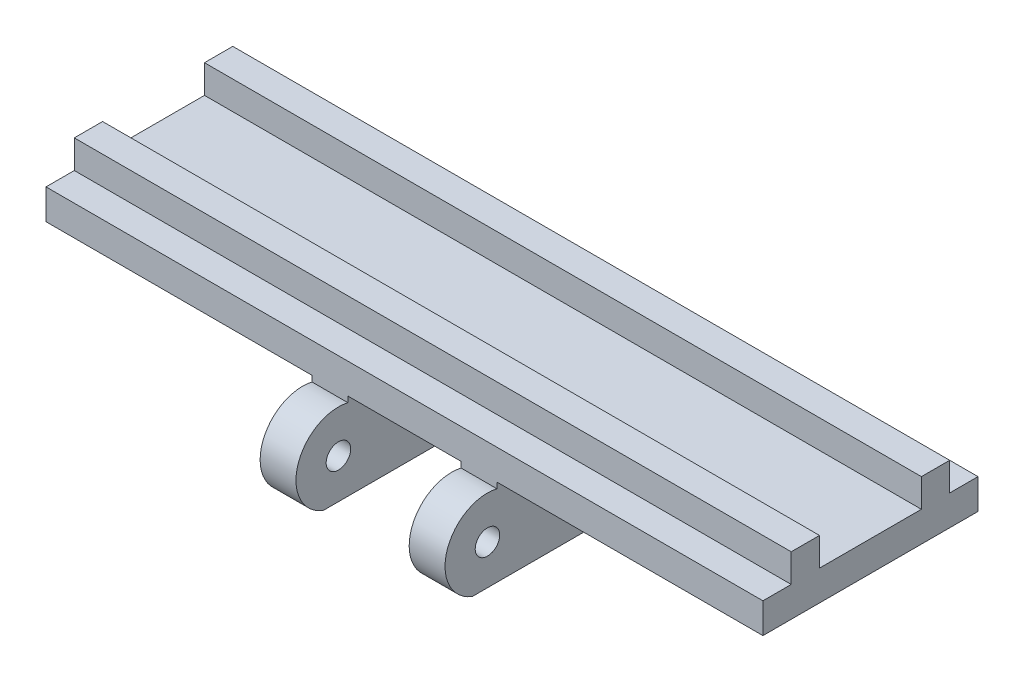
ISO-10303-21;
HEADER;
FILE_DESCRIPTION(('STEP AP214'),'2;1');
FILE_NAME('part.step','',(''),(''),'','','');
FILE_SCHEMA(('AUTOMOTIVE_DESIGN { 1 0 10303 214 1 1 1 1 }'));
ENDSEC;
DATA;
#1=APPLICATION_CONTEXT('core data for automotive mechanical design processes');
#2=APPLICATION_PROTOCOL_DEFINITION('international standard','automotive_design',2000,#1);
#3=PRODUCT_CONTEXT('',#1,'mechanical');
#4=PRODUCT('Part','Part','',(#3));
#5=PRODUCT_RELATED_PRODUCT_CATEGORY('part','',(#4));
#6=PRODUCT_DEFINITION_FORMATION('','',#4);
#7=PRODUCT_DEFINITION_CONTEXT('part definition',#1,'design');
#8=PRODUCT_DEFINITION('design','',#6,#7);
#9=PRODUCT_DEFINITION_SHAPE('','',#8);
#10=(LENGTH_UNIT() NAMED_UNIT(*) SI_UNIT(.MILLI.,.METRE.));
#11=(NAMED_UNIT(*) PLANE_ANGLE_UNIT() SI_UNIT($,.RADIAN.));
#12=(NAMED_UNIT(*) SI_UNIT($,.STERADIAN.) SOLID_ANGLE_UNIT());
#13=UNCERTAINTY_MEASURE_WITH_UNIT(LENGTH_MEASURE(1.E-05),#10,'distance_accuracy_value','');
#14=(GEOMETRIC_REPRESENTATION_CONTEXT(3) GLOBAL_UNCERTAINTY_ASSIGNED_CONTEXT((#13)) GLOBAL_UNIT_ASSIGNED_CONTEXT((#10,
#11,#12)) REPRESENTATION_CONTEXT('',''));
#15=CARTESIAN_POINT('',(0.,0.,0.));
#16=DIRECTION('',(0.,0.,1.));
#17=DIRECTION('',(1.,0.,0.));
#18=AXIS2_PLACEMENT_3D('',#15,#16,#17);
#19=CARTESIAN_POINT('',(-19.,1.6,-5.7));
#20=DIRECTION('',(0.,0.,-1.));
#21=DIRECTION('',(-1.,0.,0.));
#22=AXIS2_PLACEMENT_3D('',#19,#20,#21);
#23=PLANE('',#22);
#24=DIRECTION('',(1.,0.,0.));
#25=VECTOR('',#24,1.);
#26=CARTESIAN_POINT('',(-19.,0.,-5.7));
#27=LINE('',#26,#25);
#28=CARTESIAN_POINT('',(-5.1,0.,-5.7));
#29=VERTEX_POINT('',#28);
#30=CARTESIAN_POINT('',(5.1,0.,-5.7));
#31=VERTEX_POINT('',#30);
#32=EDGE_CURVE('E590',#29,#31,#27,.T.);
#33=ORIENTED_EDGE('',*,*,#32,.F.);
#34=DIRECTION('',(0.,1.,0.));
#35=VECTOR('',#34,1.);
#36=CARTESIAN_POINT('',(-5.1,1.6,-5.7));
#37=LINE('',#36,#35);
#38=CARTESIAN_POINT('',(-5.1,-0.306258903151968,-5.7));
#39=VERTEX_POINT('',#38);
#40=EDGE_CURVE('E369',#39,#29,#37,.T.);
#41=ORIENTED_EDGE('',*,*,#40,.F.);
#42=DIRECTION('',(1.,0.,0.));
#43=VECTOR('',#42,1.);
#44=CARTESIAN_POINT('',(-19.,-0.306258903151968,-5.7));
#45=LINE('',#44,#43);
#46=CARTESIAN_POINT('',(-7.,-0.306258903151968,-5.7));
#47=VERTEX_POINT('',#46);
#48=EDGE_CURVE('E544',#47,#39,#45,.T.);
#49=ORIENTED_EDGE('',*,*,#48,.F.);
#50=DIRECTION('',(0.,1.,0.));
#51=VECTOR('',#50,1.);
#52=CARTESIAN_POINT('',(-7.,-5.,-5.7));
#53=LINE('',#52,#51);
#54=CARTESIAN_POINT('',(-7.,0.,-5.7));
#55=VERTEX_POINT('',#54);
#56=EDGE_CURVE('E547',#47,#55,#53,.T.);
#57=ORIENTED_EDGE('',*,*,#56,.T.);
#58=CARTESIAN_POINT('',(-19.,0.,-5.7));
#59=VERTEX_POINT('',#58);
#60=EDGE_CURVE('E587',#59,#55,#27,.T.);
#61=ORIENTED_EDGE('',*,*,#60,.F.);
#62=DIRECTION('',(0.,-1.,0.));
#63=VECTOR('',#62,1.);
#64=CARTESIAN_POINT('',(-19.,1.6,-5.7));
#65=LINE('',#64,#63);
#66=CARTESIAN_POINT('',(-19.,1.6,-5.7));
#67=VERTEX_POINT('',#66);
#68=EDGE_CURVE('E593',#67,#59,#65,.T.);
#69=ORIENTED_EDGE('',*,*,#68,.F.);
#70=DIRECTION('',(1.,0.,0.));
#71=VECTOR('',#70,1.);
#72=CARTESIAN_POINT('',(-19.,1.6,-5.7));
#73=LINE('',#72,#71);
#74=CARTESIAN_POINT('',(19.,1.6,-5.7));
#75=VERTEX_POINT('',#74);
#76=EDGE_CURVE('E571',#67,#75,#73,.T.);
#77=ORIENTED_EDGE('',*,*,#76,.T.);
#78=DIRECTION('',(0.,-1.,0.));
#79=VECTOR('',#78,1.);
#80=CARTESIAN_POINT('',(19.,1.6,-5.7));
#81=LINE('',#80,#79);
#82=CARTESIAN_POINT('',(19.,0.,-5.7));
#83=VERTEX_POINT('',#82);
#84=EDGE_CURVE('E596',#75,#83,#81,.T.);
#85=ORIENTED_EDGE('',*,*,#84,.T.);
#86=CARTESIAN_POINT('',(7.,0.,-5.7));
#87=VERTEX_POINT('',#86);
#88=EDGE_CURVE('E586',#87,#83,#27,.T.);
#89=ORIENTED_EDGE('',*,*,#88,.F.);
#90=DIRECTION('',(0.,1.,0.));
#91=VECTOR('',#90,1.);
#92=CARTESIAN_POINT('',(7.,-5.,-5.7));
#93=LINE('',#92,#91);
#94=CARTESIAN_POINT('',(7.,-0.306258903151968,-5.7));
#95=VERTEX_POINT('',#94);
#96=EDGE_CURVE('E545',#95,#87,#93,.T.);
#97=ORIENTED_EDGE('',*,*,#96,.F.);
#98=CARTESIAN_POINT('',(5.1,-0.306258903151968,-5.7));
#99=VERTEX_POINT('',#98);
#100=EDGE_CURVE('E541',#99,#95,#45,.T.);
#101=ORIENTED_EDGE('',*,*,#100,.F.);
#102=DIRECTION('',(0.,1.,0.));
#103=VECTOR('',#102,1.);
#104=CARTESIAN_POINT('',(5.1,1.6,-5.7));
#105=LINE('',#104,#103);
#106=EDGE_CURVE('E516',#99,#31,#105,.T.);
#107=ORIENTED_EDGE('',*,*,#106,.T.);
#108=EDGE_LOOP('',(#33,#41,#49,#57,#61,#69,#77,#85,#89,#97,#101,#107));
#109=FACE_BOUND('',#108,.T.);
#110=ADVANCED_FACE('F137',(#109),#23,.T.);
#111=CARTESIAN_POINT('',(-19.,-4.60297408448131,7.));
#112=DIRECTION('',(0.,-1.,0.));
#113=DIRECTION('',(0.,0.,-1.));
#114=AXIS2_PLACEMENT_3D('',#111,#112,#113);
#115=PLANE('',#114);
#116=DIRECTION('',(1.,0.,0.));
#117=VECTOR('',#116,1.);
#118=CARTESIAN_POINT('',(-11.6785538245428,-4.60297408448131,-1.));
#119=LINE('',#118,#117);
#120=CARTESIAN_POINT('',(3.,-4.60297408448131,-1.));
#121=VERTEX_POINT('',#120);
#122=CARTESIAN_POINT('',(5.1,-4.60297408448131,-1.));
#123=VERTEX_POINT('',#122);
#124=EDGE_CURVE('E355',#121,#123,#119,.T.);
#125=ORIENTED_EDGE('',*,*,#124,.T.);
#126=DIRECTION('',(0.,0.,1.));
#127=VECTOR('',#126,1.);
#128=CARTESIAN_POINT('',(5.1,-4.60297408448131,0.));
#129=LINE('',#128,#127);
#130=CARTESIAN_POINT('',(5.1,-4.60297408448131,-7.));
#131=VERTEX_POINT('',#130);
#132=EDGE_CURVE('E473',#131,#123,#129,.T.);
#133=ORIENTED_EDGE('',*,*,#132,.F.);
#134=DIRECTION('',(1.,0.,0.));
#135=VECTOR('',#134,1.);
#136=CARTESIAN_POINT('',(-19.,-4.60297408448131,-7.));
#137=LINE('',#136,#135);
#138=CARTESIAN_POINT('',(7.,-4.60297408448131,-7.));
#139=VERTEX_POINT('',#138);
#140=EDGE_CURVE('E477',#139,#131,#137,.F.);
#141=ORIENTED_EDGE('',*,*,#140,.F.);
#142=DIRECTION('',(0.,0.,1.));
#143=VECTOR('',#142,1.);
#144=CARTESIAN_POINT('',(7.,-4.60297408448131,-7.));
#145=LINE('',#144,#143);
#146=CARTESIAN_POINT('',(7.,-4.60297408448131,1.));
#147=VERTEX_POINT('',#146);
#148=EDGE_CURVE('E480',#139,#147,#145,.T.);
#149=ORIENTED_EDGE('',*,*,#148,.T.);
#150=DIRECTION('',(-1.,0.,0.));
#151=VECTOR('',#150,1.);
#152=CARTESIAN_POINT('',(19.,-4.60297408448131,1.));
#153=LINE('',#152,#151);
#154=CARTESIAN_POINT('',(4.9,-4.60297408448131,1.));
#155=VERTEX_POINT('',#154);
#156=EDGE_CURVE('E390',#147,#155,#153,.T.);
#157=ORIENTED_EDGE('',*,*,#156,.T.);
#158=DIRECTION('',(0.,0.,1.));
#159=VECTOR('',#158,1.);
#160=CARTESIAN_POINT('',(4.9,-4.60297408448131,0.));
#161=LINE('',#160,#159);
#162=CARTESIAN_POINT('',(4.9,-4.60297408448131,7.));
#163=VERTEX_POINT('',#162);
#164=EDGE_CURVE('E483',#155,#163,#161,.T.);
#165=ORIENTED_EDGE('',*,*,#164,.T.);
#166=DIRECTION('',(-1.,0.,0.));
#167=VECTOR('',#166,1.);
#168=CARTESIAN_POINT('',(10.1737557774323,-4.60297408448131,7.));
#169=LINE('',#168,#167);
#170=CARTESIAN_POINT('',(3.,-4.60297408448131,7.));
#171=VERTEX_POINT('',#170);
#172=EDGE_CURVE('E488',#171,#163,#169,.F.);
#173=ORIENTED_EDGE('',*,*,#172,.F.);
#174=DIRECTION('',(0.,0.,1.));
#175=VECTOR('',#174,1.);
#176=CARTESIAN_POINT('',(3.,-4.60297408448131,-7.));
#177=LINE('',#176,#175);
#178=EDGE_CURVE('E475',#121,#171,#177,.T.);
#179=ORIENTED_EDGE('',*,*,#178,.F.);
#180=EDGE_LOOP('',(#125,#133,#141,#149,#157,#165,#173,#179));
#181=FACE_BOUND('',#180,.T.);
#182=ADVANCED_FACE('F632',(#181),#115,.T.);
#183=CARTESIAN_POINT('',(0.,1.6,0.));
#184=DIRECTION('',(0.,1.,0.));
#185=DIRECTION('',(0.,0.,1.));
#186=AXIS2_PLACEMENT_3D('',#183,#184,#185);
#187=PLANE('',#186);
#188=DIRECTION('',(0.,0.,-1.));
#189=VECTOR('',#188,1.);
#190=CARTESIAN_POINT('',(19.,1.6,5.7));
#191=LINE('',#190,#189);
#192=CARTESIAN_POINT('',(19.,1.6,5.7));
#193=VERTEX_POINT('',#192);
#194=CARTESIAN_POINT('',(19.,1.6,4.2));
#195=VERTEX_POINT('',#194);
#196=EDGE_CURVE('E160',#193,#195,#191,.T.);
#197=ORIENTED_EDGE('',*,*,#196,.T.);
#198=DIRECTION('',(1.,0.,0.));
#199=VECTOR('',#198,1.);
#200=CARTESIAN_POINT('',(-19.,1.6,4.2));
#201=LINE('',#200,#199);
#202=CARTESIAN_POINT('',(-19.,1.6,4.2));
#203=VERTEX_POINT('',#202);
#204=EDGE_CURVE('E422',#203,#195,#201,.T.);
#205=ORIENTED_EDGE('',*,*,#204,.F.);
#206=DIRECTION('',(0.,0.,-1.));
#207=VECTOR('',#206,1.);
#208=CARTESIAN_POINT('',(-19.,1.6,5.7));
#209=LINE('',#208,#207);
#210=CARTESIAN_POINT('',(-19.,1.6,5.7));
#211=VERTEX_POINT('',#210);
#212=EDGE_CURVE('E576',#211,#203,#209,.T.);
#213=ORIENTED_EDGE('',*,*,#212,.F.);
#214=DIRECTION('',(1.,0.,0.));
#215=VECTOR('',#214,1.);
#216=CARTESIAN_POINT('',(-19.,1.6,5.7));
#217=LINE('',#216,#215);
#218=EDGE_CURVE('E566',#211,#193,#217,.T.);
#219=ORIENTED_EDGE('',*,*,#218,.T.);
#220=EDGE_LOOP('',(#197,#205,#213,#219));
#221=FACE_BOUND('',#220,.T.);
#222=ADVANCED_FACE('F638',(#221),#187,.T.);
#223=CARTESIAN_POINT('',(-19.,1.6,-4.2));
#224=VERTEX_POINT('',#223);
#225=EDGE_CURVE('E575',#224,#67,#209,.T.);
#226=ORIENTED_EDGE('',*,*,#225,.F.);
#227=DIRECTION('',(1.,0.,0.));
#228=VECTOR('',#227,1.);
#229=CARTESIAN_POINT('',(-19.,1.6,-4.19999999999999));
#230=LINE('',#229,#228);
#231=CARTESIAN_POINT('',(19.,1.6,-4.2));
#232=VERTEX_POINT('',#231);
#233=EDGE_CURVE('E426',#224,#232,#230,.T.);
#234=ORIENTED_EDGE('',*,*,#233,.T.);
#235=EDGE_CURVE('E568',#232,#75,#191,.T.);
#236=ORIENTED_EDGE('',*,*,#235,.T.);
#237=ORIENTED_EDGE('',*,*,#76,.F.);
#238=EDGE_LOOP('',(#226,#234,#236,#237));
#239=FACE_BOUND('',#238,.T.);
#240=ADVANCED_FACE('F665',(#239),#187,.T.);
#241=CARTESIAN_POINT('',(3.,-5.,-7.));
#242=DIRECTION('',(-1.,0.,0.));
#243=DIRECTION('',(0.,0.,1.));
#244=AXIS2_PLACEMENT_3D('',#241,#242,#243);
#245=PLANE('',#244);
#246=DIRECTION('',(0.,1.,0.));
#247=VECTOR('',#246,1.);
#248=CARTESIAN_POINT('',(3.,-5.,-1.));
#249=LINE('',#248,#247);
#250=CARTESIAN_POINT('',(3.,0.,-1.));
#251=VERTEX_POINT('',#250);
#252=EDGE_CURVE('E380',#121,#251,#249,.T.);
#253=ORIENTED_EDGE('',*,*,#252,.F.);
#254=ORIENTED_EDGE('',*,*,#178,.T.);
#255=CARTESIAN_POINT('',(3.,-2.5,6.2));
#256=DIRECTION('',(-1.,0.,0.));
#257=DIRECTION('',(0.,0.,1.));
#258=AXIS2_PLACEMENT_3D('',#255,#256,#257);
#259=CIRCLE('',#258,2.25);
#260=CARTESIAN_POINT('',(3.,-0.306258903151968,5.7));
#261=VERTEX_POINT('',#260);
#262=EDGE_CURVE('E507',#171,#261,#259,.T.);
#263=ORIENTED_EDGE('',*,*,#262,.T.);
#264=DIRECTION('',(0.,1.,0.));
#265=VECTOR('',#264,1.);
#266=CARTESIAN_POINT('',(3.,-5.,5.7));
#267=LINE('',#266,#265);
#268=CARTESIAN_POINT('',(3.,0.,5.7));
#269=VERTEX_POINT('',#268);
#270=EDGE_CURVE('E504',#261,#269,#267,.T.);
#271=ORIENTED_EDGE('',*,*,#270,.T.);
#272=DIRECTION('',(0.,0.,1.));
#273=VECTOR('',#272,1.);
#274=CARTESIAN_POINT('',(3.,0.,-7.));
#275=LINE('',#274,#273);
#276=EDGE_CURVE('E562',#251,#269,#275,.T.);
#277=ORIENTED_EDGE('',*,*,#276,.F.);
#278=EDGE_LOOP('',(#253,#254,#263,#271,#277));
#279=FACE_BOUND('',#278,.T.);
#280=CARTESIAN_POINT('',(3.,-2.5,6.2));
#281=DIRECTION('',(-1.,0.,0.));
#282=DIRECTION('',(0.,0.,1.));
#283=AXIS2_PLACEMENT_3D('',#280,#281,#282);
#284=CIRCLE('',#283,0.65);
#285=CARTESIAN_POINT('',(3.,-2.5,6.85));
#286=VERTEX_POINT('',#285);
#287=EDGE_CURVE('E526',#286,#286,#284,.T.);
#288=ORIENTED_EDGE('',*,*,#287,.F.);
#289=EDGE_LOOP('',(#288));
#290=FACE_BOUND('',#289,.T.);
#291=ADVANCED_FACE('F758',(#279,#290),#245,.T.);
#292=CARTESIAN_POINT('',(-3.,-5.,-7.));
#293=DIRECTION('',(-1.,0.,0.));
#294=DIRECTION('',(0.,0.,1.));
#295=AXIS2_PLACEMENT_3D('',#292,#293,#294);
#296=PLANE('',#295);
#297=CARTESIAN_POINT('',(-3.,-2.5,6.2));
#298=DIRECTION('',(-1.,0.,0.));
#299=DIRECTION('',(0.,0.,1.));
#300=AXIS2_PLACEMENT_3D('',#297,#298,#299);
#301=CIRCLE('',#300,0.65);
#302=CARTESIAN_POINT('',(-3.,-2.5,6.85));
#303=VERTEX_POINT('',#302);
#304=EDGE_CURVE('E523',#303,#303,#301,.T.);
#305=ORIENTED_EDGE('',*,*,#304,.T.);
#306=EDGE_LOOP('',(#305));
#307=FACE_BOUND('',#306,.T.);
#308=DIRECTION('',(0.,0.,1.));
#309=VECTOR('',#308,1.);
#310=CARTESIAN_POINT('',(-3.,-4.60297408448131,-7.));
#311=LINE('',#310,#309);
#312=CARTESIAN_POINT('',(-3.,-4.60297408448131,-1.));
#313=VERTEX_POINT('',#312);
#314=CARTESIAN_POINT('',(-3.,-4.60297408448131,7.));
#315=VERTEX_POINT('',#314);
#316=EDGE_CURVE('E463',#313,#315,#311,.T.);
#317=ORIENTED_EDGE('',*,*,#316,.F.);
#318=DIRECTION('',(0.,1.,0.));
#319=VECTOR('',#318,1.);
#320=CARTESIAN_POINT('',(-3.,-5.,-1.));
#321=LINE('',#320,#319);
#322=CARTESIAN_POINT('',(-3.,0.,-1.));
#323=VERTEX_POINT('',#322);
#324=EDGE_CURVE('E377',#313,#323,#321,.T.);
#325=ORIENTED_EDGE('',*,*,#324,.T.);
#326=DIRECTION('',(0.,0.,1.));
#327=VECTOR('',#326,1.);
#328=CARTESIAN_POINT('',(-3.,0.,0.));
#329=LINE('',#328,#327);
#330=CARTESIAN_POINT('',(-3.,0.,5.7));
#331=VERTEX_POINT('',#330);
#332=EDGE_CURVE('E363',#323,#331,#329,.T.);
#333=ORIENTED_EDGE('',*,*,#332,.T.);
#334=DIRECTION('',(0.,1.,0.));
#335=VECTOR('',#334,1.);
#336=CARTESIAN_POINT('',(-3.,-5.,5.7));
#337=LINE('',#336,#335);
#338=CARTESIAN_POINT('',(-3.,-0.306258903151968,5.7));
#339=VERTEX_POINT('',#338);
#340=EDGE_CURVE('E498',#339,#331,#337,.T.);
#341=ORIENTED_EDGE('',*,*,#340,.F.);
#342=CARTESIAN_POINT('',(-3.,-2.5,6.2));
#343=DIRECTION('',(-1.,0.,0.));
#344=DIRECTION('',(0.,0.,1.));
#345=AXIS2_PLACEMENT_3D('',#342,#343,#344);
#346=CIRCLE('',#345,2.25);
#347=EDGE_CURVE('E513',#315,#339,#346,.T.);
#348=ORIENTED_EDGE('',*,*,#347,.F.);
#349=EDGE_LOOP('',(#317,#325,#333,#341,#348));
#350=FACE_BOUND('',#349,.T.);
#351=ADVANCED_FACE('F701',(#307,#350),#296,.F.);
#352=CARTESIAN_POINT('',(-4.9,-5.,0.));
#353=DIRECTION('',(-1.,0.,0.));
#354=DIRECTION('',(0.,0.,1.));
#355=AXIS2_PLACEMENT_3D('',#352,#353,#354);
#356=PLANE('',#355);
#357=CARTESIAN_POINT('',(-4.9,-2.5,6.2));
#358=DIRECTION('',(-1.,0.,0.));
#359=DIRECTION('',(0.,0.,1.));
#360=AXIS2_PLACEMENT_3D('',#357,#358,#359);
#361=CIRCLE('',#360,0.65);
#362=CARTESIAN_POINT('',(-4.9,-2.5,6.85));
#363=VERTEX_POINT('',#362);
#364=EDGE_CURVE('E520',#363,#363,#361,.T.);
#365=ORIENTED_EDGE('',*,*,#364,.F.);
#366=EDGE_LOOP('',(#365));
#367=FACE_BOUND('',#366,.T.);
#368=DIRECTION('',(0.,1.,0.));
#369=VECTOR('',#368,1.);
#370=CARTESIAN_POINT('',(-4.9,-5.,5.7));
#371=LINE('',#370,#369);
#372=CARTESIAN_POINT('',(-4.9,-0.306258903151968,5.7));
#373=VERTEX_POINT('',#372);
#374=CARTESIAN_POINT('',(-4.9,0.,5.7));
#375=VERTEX_POINT('',#374);
#376=EDGE_CURVE('E495',#373,#375,#371,.T.);
#377=ORIENTED_EDGE('',*,*,#376,.T.);
#378=DIRECTION('',(0.,0.,1.));
#379=VECTOR('',#378,1.);
#380=CARTESIAN_POINT('',(-4.9,0.,0.));
#381=LINE('',#380,#379);
#382=CARTESIAN_POINT('',(-4.9,0.,1.));
#383=VERTEX_POINT('',#382);
#384=EDGE_CURVE('E396',#383,#375,#381,.T.);
#385=ORIENTED_EDGE('',*,*,#384,.F.);
#386=DIRECTION('',(0.,1.,0.));
#387=VECTOR('',#386,1.);
#388=CARTESIAN_POINT('',(-4.9,-5.,1.));
#389=LINE('',#388,#387);
#390=CARTESIAN_POINT('',(-4.9,-4.60297408448131,1.));
#391=VERTEX_POINT('',#390);
#392=EDGE_CURVE('E399',#391,#383,#389,.T.);
#393=ORIENTED_EDGE('',*,*,#392,.F.);
#394=DIRECTION('',(0.,0.,1.));
#395=VECTOR('',#394,1.);
#396=CARTESIAN_POINT('',(-4.9,-4.60297408448131,0.));
#397=LINE('',#396,#395);
#398=CARTESIAN_POINT('',(-4.9,-4.60297408448131,7.));
#399=VERTEX_POINT('',#398);
#400=EDGE_CURVE('E471',#391,#399,#397,.T.);
#401=ORIENTED_EDGE('',*,*,#400,.T.);
#402=CARTESIAN_POINT('',(-4.9,-2.5,6.2));
#403=DIRECTION('',(-1.,0.,0.));
#404=DIRECTION('',(0.,0.,1.));
#405=AXIS2_PLACEMENT_3D('',#402,#403,#404);
#406=CIRCLE('',#405,2.25);
#407=EDGE_CURVE('E510',#399,#373,#406,.T.);
#408=ORIENTED_EDGE('',*,*,#407,.T.);
#409=EDGE_LOOP('',(#377,#385,#393,#401,#408));
#410=FACE_BOUND('',#409,.T.);
#411=ADVANCED_FACE('F690',(#367,#410),#356,.T.);
#412=CARTESIAN_POINT('',(4.9,-5.,0.));
#413=DIRECTION('',(-1.,0.,0.));
#414=DIRECTION('',(0.,0.,1.));
#415=AXIS2_PLACEMENT_3D('',#412,#413,#414);
#416=PLANE('',#415);
#417=CARTESIAN_POINT('',(4.9,-2.5,6.2));
#418=DIRECTION('',(-1.,0.,0.));
#419=DIRECTION('',(0.,0.,1.));
#420=AXIS2_PLACEMENT_3D('',#417,#418,#419);
#421=CIRCLE('',#420,0.65);
#422=CARTESIAN_POINT('',(4.9,-2.5,6.85));
#423=VERTEX_POINT('',#422);
#424=EDGE_CURVE('E519',#423,#423,#421,.T.);
#425=ORIENTED_EDGE('',*,*,#424,.T.);
#426=EDGE_LOOP('',(#425));
#427=FACE_BOUND('',#426,.T.);
#428=DIRECTION('',(0.,1.,0.));
#429=VECTOR('',#428,1.);
#430=CARTESIAN_POINT('',(4.9,-5.,5.7));
#431=LINE('',#430,#429);
#432=CARTESIAN_POINT('',(4.9,-0.306258903151968,5.7));
#433=VERTEX_POINT('',#432);
#434=CARTESIAN_POINT('',(4.9,0.,5.7));
#435=VERTEX_POINT('',#434);
#436=EDGE_CURVE('E499',#433,#435,#431,.T.);
#437=ORIENTED_EDGE('',*,*,#436,.F.);
#438=CARTESIAN_POINT('',(4.9,-2.5,6.2));
#439=DIRECTION('',(-1.,0.,0.));
#440=DIRECTION('',(0.,0.,1.));
#441=AXIS2_PLACEMENT_3D('',#438,#439,#440);
#442=CIRCLE('',#441,2.25);
#443=EDGE_CURVE('E12',#163,#433,#442,.T.);
#444=ORIENTED_EDGE('',*,*,#443,.F.);
#445=ORIENTED_EDGE('',*,*,#164,.F.);
#446=DIRECTION('',(0.,-1.,0.));
#447=VECTOR('',#446,1.);
#448=CARTESIAN_POINT('',(4.9,-5.,1.));
#449=LINE('',#448,#447);
#450=CARTESIAN_POINT('',(4.9,0.,1.));
#451=VERTEX_POINT('',#450);
#452=EDGE_CURVE('E382',#451,#155,#449,.T.);
#453=ORIENTED_EDGE('',*,*,#452,.F.);
#454=DIRECTION('',(0.,0.,-1.));
#455=VECTOR('',#454,1.);
#456=CARTESIAN_POINT('',(4.9,0.,0.));
#457=LINE('',#456,#455);
#458=EDGE_CURVE('E385',#435,#451,#457,.T.);
#459=ORIENTED_EDGE('',*,*,#458,.F.);
#460=EDGE_LOOP('',(#437,#444,#445,#453,#459));
#461=FACE_BOUND('',#460,.T.);
#462=ADVANCED_FACE('F608',(#427,#461),#416,.F.);
#463=CARTESIAN_POINT('',(-7.,-5.,-7.));
#464=DIRECTION('',(-1.,0.,0.));
#465=DIRECTION('',(0.,0.,1.));
#466=AXIS2_PLACEMENT_3D('',#463,#464,#465);
#467=PLANE('',#466);
#468=DIRECTION('',(0.,-1.,0.));
#469=VECTOR('',#468,1.);
#470=CARTESIAN_POINT('',(-7.,-5.,1.));
#471=LINE('',#470,#469);
#472=CARTESIAN_POINT('',(-7.,0.,1.));
#473=VERTEX_POINT('',#472);
#474=CARTESIAN_POINT('',(-7.,-4.60297408448131,1.));
#475=VERTEX_POINT('',#474);
#476=EDGE_CURVE('E407',#473,#475,#471,.T.);
#477=ORIENTED_EDGE('',*,*,#476,.F.);
#478=DIRECTION('',(0.,0.,1.));
#479=VECTOR('',#478,1.);
#480=CARTESIAN_POINT('',(-7.,0.,0.));
#481=LINE('',#480,#479);
#482=EDGE_CURVE('E565',#55,#473,#481,.T.);
#483=ORIENTED_EDGE('',*,*,#482,.F.);
#484=ORIENTED_EDGE('',*,*,#56,.F.);
#485=CARTESIAN_POINT('',(-7.,-2.5,-6.2));
#486=DIRECTION('',(-1.,0.,0.));
#487=DIRECTION('',(0.,0.,1.));
#488=AXIS2_PLACEMENT_3D('',#485,#486,#487);
#489=CIRCLE('',#488,2.25);
#490=CARTESIAN_POINT('',(-7.,-4.60297408448131,-7.));
#491=VERTEX_POINT('',#490);
#492=EDGE_CURVE('E555',#47,#491,#489,.T.);
#493=ORIENTED_EDGE('',*,*,#492,.T.);
#494=DIRECTION('',(0.,0.,1.));
#495=VECTOR('',#494,1.);
#496=CARTESIAN_POINT('',(-7.,-4.60297408448131,-7.));
#497=LINE('',#496,#495);
#498=EDGE_CURVE('E468',#491,#475,#497,.T.);
#499=ORIENTED_EDGE('',*,*,#498,.T.);
#500=EDGE_LOOP('',(#477,#483,#484,#493,#499));
#501=FACE_BOUND('',#500,.T.);
#502=CARTESIAN_POINT('',(-7.,-2.5,-6.2));
#503=DIRECTION('',(-1.,0.,0.));
#504=DIRECTION('',(0.,0.,1.));
#505=AXIS2_PLACEMENT_3D('',#502,#503,#504);
#506=CIRCLE('',#505,0.55);
#507=CARTESIAN_POINT('',(-7.,-2.5,-5.65));
#508=VERTEX_POINT('',#507);
#509=EDGE_CURVE('E538',#508,#508,#506,.T.);
#510=ORIENTED_EDGE('',*,*,#509,.F.);
#511=EDGE_LOOP('',(#510));
#512=FACE_BOUND('',#511,.T.);
#513=ADVANCED_FACE('F708',(#501,#512),#467,.T.);
#514=CARTESIAN_POINT('',(7.,-5.,-7.));
#515=DIRECTION('',(-1.,0.,0.));
#516=DIRECTION('',(0.,0.,1.));
#517=AXIS2_PLACEMENT_3D('',#514,#515,#516);
#518=PLANE('',#517);
#519=CARTESIAN_POINT('',(7.,-2.5,-6.2));
#520=DIRECTION('',(-1.,0.,0.));
#521=DIRECTION('',(0.,0.,1.));
#522=AXIS2_PLACEMENT_3D('',#519,#520,#521);
#523=CIRCLE('',#522,0.55);
#524=CARTESIAN_POINT('',(7.,-2.5,-5.65));
#525=VERTEX_POINT('',#524);
#526=EDGE_CURVE('E535',#525,#525,#523,.T.);
#527=ORIENTED_EDGE('',*,*,#526,.T.);
#528=EDGE_LOOP('',(#527));
#529=FACE_BOUND('',#528,.T.);
#530=DIRECTION('',(0.,0.,1.));
#531=VECTOR('',#530,1.);
#532=CARTESIAN_POINT('',(7.,0.,-7.));
#533=LINE('',#532,#531);
#534=CARTESIAN_POINT('',(7.,0.,1.));
#535=VERTEX_POINT('',#534);
#536=EDGE_CURVE('E559',#87,#535,#533,.T.);
#537=ORIENTED_EDGE('',*,*,#536,.T.);
#538=DIRECTION('',(0.,-1.,0.));
#539=VECTOR('',#538,1.);
#540=CARTESIAN_POINT('',(7.,-5.,1.));
#541=LINE('',#540,#539);
#542=EDGE_CURVE('E393',#535,#147,#541,.T.);
#543=ORIENTED_EDGE('',*,*,#542,.T.);
#544=ORIENTED_EDGE('',*,*,#148,.F.);
#545=CARTESIAN_POINT('',(7.,-2.5,-6.2));
#546=DIRECTION('',(-1.,0.,0.));
#547=DIRECTION('',(0.,0.,1.));
#548=AXIS2_PLACEMENT_3D('',#545,#546,#547);
#549=CIRCLE('',#548,2.25);
#550=EDGE_CURVE('E549',#95,#139,#549,.T.);
#551=ORIENTED_EDGE('',*,*,#550,.F.);
#552=ORIENTED_EDGE('',*,*,#96,.T.);
#553=EDGE_LOOP('',(#537,#543,#544,#551,#552));
#554=FACE_BOUND('',#553,.T.);
#555=ADVANCED_FACE('F769',(#529,#554),#518,.F.);
#556=CARTESIAN_POINT('',(-5.1,-5.,0.));
#557=DIRECTION('',(-1.,0.,0.));
#558=DIRECTION('',(0.,0.,1.));
#559=AXIS2_PLACEMENT_3D('',#556,#557,#558);
#560=PLANE('',#559);
#561=CARTESIAN_POINT('',(-5.1,-2.5,-6.2));
#562=DIRECTION('',(-1.,0.,0.));
#563=DIRECTION('',(0.,0.,1.));
#564=AXIS2_PLACEMENT_3D('',#561,#562,#563);
#565=CIRCLE('',#564,0.55);
#566=CARTESIAN_POINT('',(-5.1,-2.5,-5.65));
#567=VERTEX_POINT('',#566);
#568=EDGE_CURVE('E529',#567,#567,#565,.T.);
#569=ORIENTED_EDGE('',*,*,#568,.T.);
#570=EDGE_LOOP('',(#569));
#571=FACE_BOUND('',#570,.T.);
#572=DIRECTION('',(0.,-1.,0.));
#573=VECTOR('',#572,1.);
#574=CARTESIAN_POINT('',(-5.1,-5.,-1.));
#575=LINE('',#574,#573);
#576=CARTESIAN_POINT('',(-5.1,0.,-1.));
#577=VERTEX_POINT('',#576);
#578=CARTESIAN_POINT('',(-5.1,-4.60297408448131,-1.));
#579=VERTEX_POINT('',#578);
#580=EDGE_CURVE('E345',#577,#579,#575,.T.);
#581=ORIENTED_EDGE('',*,*,#580,.T.);
#582=DIRECTION('',(0.,0.,1.));
#583=VECTOR('',#582,1.);
#584=CARTESIAN_POINT('',(-5.1,-4.60297408448131,0.));
#585=LINE('',#584,#583);
#586=CARTESIAN_POINT('',(-5.1,-4.60297408448131,-7.));
#587=VERTEX_POINT('',#586);
#588=EDGE_CURVE('E453',#587,#579,#585,.T.);
#589=ORIENTED_EDGE('',*,*,#588,.F.);
#590=CARTESIAN_POINT('',(-5.1,-2.5,-6.2));
#591=DIRECTION('',(-1.,0.,0.));
#592=DIRECTION('',(0.,0.,1.));
#593=AXIS2_PLACEMENT_3D('',#590,#591,#592);
#594=CIRCLE('',#593,2.25);
#595=EDGE_CURVE('E552',#39,#587,#594,.T.);
#596=ORIENTED_EDGE('',*,*,#595,.F.);
#597=ORIENTED_EDGE('',*,*,#40,.T.);
#598=DIRECTION('',(0.,0.,1.));
#599=VECTOR('',#598,1.);
#600=CARTESIAN_POINT('',(-5.1,0.,0.));
#601=LINE('',#600,#599);
#602=EDGE_CURVE('E361',#29,#577,#601,.T.);
#603=ORIENTED_EDGE('',*,*,#602,.T.);
#604=EDGE_LOOP('',(#581,#589,#596,#597,#603));
#605=FACE_BOUND('',#604,.T.);
#606=ADVANCED_FACE('F367',(#571,#605),#560,.F.);
#607=CARTESIAN_POINT('',(5.1,-5.,0.));
#608=DIRECTION('',(-1.,0.,0.));
#609=DIRECTION('',(0.,0.,1.));
#610=AXIS2_PLACEMENT_3D('',#607,#608,#609);
#611=PLANE('',#610);
#612=CARTESIAN_POINT('',(5.1,-2.5,-6.2));
#613=DIRECTION('',(-1.,0.,0.));
#614=DIRECTION('',(0.,0.,1.));
#615=AXIS2_PLACEMENT_3D('',#612,#613,#614);
#616=CIRCLE('',#615,0.55);
#617=CARTESIAN_POINT('',(5.1,-2.5,-5.65));
#618=VERTEX_POINT('',#617);
#619=EDGE_CURVE('E532',#618,#618,#616,.T.);
#620=ORIENTED_EDGE('',*,*,#619,.F.);
#621=EDGE_LOOP('',(#620));
#622=FACE_BOUND('',#621,.T.);
#623=DIRECTION('',(0.,0.,1.));
#624=VECTOR('',#623,1.);
#625=CARTESIAN_POINT('',(5.1,0.,0.));
#626=LINE('',#625,#624);
#627=CARTESIAN_POINT('',(5.1,0.,-1.));
#628=VERTEX_POINT('',#627);
#629=EDGE_CURVE('E373',#31,#628,#626,.T.);
#630=ORIENTED_EDGE('',*,*,#629,.F.);
#631=ORIENTED_EDGE('',*,*,#106,.F.);
#632=CARTESIAN_POINT('',(5.1,-2.5,-6.2));
#633=DIRECTION('',(-1.,0.,0.));
#634=DIRECTION('',(0.,0.,1.));
#635=AXIS2_PLACEMENT_3D('',#632,#633,#634);
#636=CIRCLE('',#635,2.25);
#637=EDGE_CURVE('E145',#99,#131,#636,.T.);
#638=ORIENTED_EDGE('',*,*,#637,.T.);
#639=ORIENTED_EDGE('',*,*,#132,.T.);
#640=DIRECTION('',(0.,-1.,0.));
#641=VECTOR('',#640,1.);
#642=CARTESIAN_POINT('',(5.1,-5.,-1.));
#643=LINE('',#642,#641);
#644=EDGE_CURVE('E370',#628,#123,#643,.T.);
#645=ORIENTED_EDGE('',*,*,#644,.F.);
#646=EDGE_LOOP('',(#630,#631,#638,#639,#645));
#647=FACE_BOUND('',#646,.T.);
#648=ADVANCED_FACE('F776',(#622,#647),#611,.T.);
#649=CARTESIAN_POINT('',(-19.,-2.5,-6.2));
#650=DIRECTION('',(1.,0.,0.));
#651=DIRECTION('',(0.,0.,-1.));
#652=AXIS2_PLACEMENT_3D('',#649,#650,#651);
#653=CYLINDRICAL_SURFACE('',#652,2.25);
#654=ORIENTED_EDGE('',*,*,#550,.T.);
#655=ORIENTED_EDGE('',*,*,#140,.T.);
#656=ORIENTED_EDGE('',*,*,#637,.F.);
#657=ORIENTED_EDGE('',*,*,#100,.T.);
#658=EDGE_LOOP('',(#654,#655,#656,#657));
#659=FACE_BOUND('',#658,.T.);
#660=ADVANCED_FACE('F773',(#659),#653,.T.);
#661=ORIENTED_EDGE('',*,*,#595,.T.);
#662=DIRECTION('',(1.,0.,0.));
#663=VECTOR('',#662,1.);
#664=CARTESIAN_POINT('',(-19.,-4.60297408448131,-7.));
#665=LINE('',#664,#663);
#666=EDGE_CURVE('E465',#587,#491,#665,.F.);
#667=ORIENTED_EDGE('',*,*,#666,.T.);
#668=ORIENTED_EDGE('',*,*,#492,.F.);
#669=ORIENTED_EDGE('',*,*,#48,.T.);
#670=EDGE_LOOP('',(#661,#667,#668,#669));
#671=FACE_BOUND('',#670,.T.);
#672=ADVANCED_FACE('F705',(#671),#653,.T.);
#673=CARTESIAN_POINT('',(-19.,-2.5,-6.2));
#674=DIRECTION('',(1.,0.,0.));
#675=DIRECTION('',(0.,0.,-1.));
#676=AXIS2_PLACEMENT_3D('',#673,#674,#675);
#677=CYLINDRICAL_SURFACE('',#676,0.55);
#678=ORIENTED_EDGE('',*,*,#526,.F.);
#679=EDGE_LOOP('',(#678));
#680=FACE_BOUND('',#679,.T.);
#681=ORIENTED_EDGE('',*,*,#619,.T.);
#682=EDGE_LOOP('',(#681));
#683=FACE_BOUND('',#682,.T.);
#684=ADVANCED_FACE('F752',(#680,#683),#677,.F.);
#685=CARTESIAN_POINT('',(-19.,1.6,5.7));
#686=DIRECTION('',(0.,0.,-1.));
#687=DIRECTION('',(-1.,0.,0.));
#688=AXIS2_PLACEMENT_3D('',#685,#686,#687);
#689=PLANE('',#688);
#690=ORIENTED_EDGE('',*,*,#436,.T.);
#691=DIRECTION('',(1.,0.,0.));
#692=VECTOR('',#691,1.);
#693=CARTESIAN_POINT('',(-19.,0.,5.7));
#694=LINE('',#693,#692);
#695=CARTESIAN_POINT('',(19.,0.,5.7));
#696=VERTEX_POINT('',#695);
#697=EDGE_CURVE('E558',#435,#696,#694,.T.);
#698=ORIENTED_EDGE('',*,*,#697,.T.);
#699=DIRECTION('',(0.,-1.,0.));
#700=VECTOR('',#699,1.);
#701=CARTESIAN_POINT('',(19.,1.6,5.7));
#702=LINE('',#701,#700);
#703=EDGE_CURVE('E563',#193,#696,#702,.T.);
#704=ORIENTED_EDGE('',*,*,#703,.F.);
#705=ORIENTED_EDGE('',*,*,#218,.F.);
#706=DIRECTION('',(0.,-1.,0.));
#707=VECTOR('',#706,1.);
#708=CARTESIAN_POINT('',(-19.,1.6,5.7));
#709=LINE('',#708,#707);
#710=CARTESIAN_POINT('',(-19.,0.,5.7));
#711=VERTEX_POINT('',#710);
#712=EDGE_CURVE('E579',#211,#711,#709,.T.);
#713=ORIENTED_EDGE('',*,*,#712,.T.);
#714=EDGE_CURVE('E581',#711,#375,#694,.T.);
#715=ORIENTED_EDGE('',*,*,#714,.T.);
#716=ORIENTED_EDGE('',*,*,#376,.F.);
#717=DIRECTION('',(1.,0.,0.));
#718=VECTOR('',#717,1.);
#719=CARTESIAN_POINT('',(-19.,-0.306258903151968,5.7));
#720=LINE('',#719,#718);
#721=EDGE_CURVE('E494',#373,#339,#720,.T.);
#722=ORIENTED_EDGE('',*,*,#721,.T.);
#723=ORIENTED_EDGE('',*,*,#340,.T.);
#724=EDGE_CURVE('E584',#331,#269,#694,.T.);
#725=ORIENTED_EDGE('',*,*,#724,.T.);
#726=ORIENTED_EDGE('',*,*,#270,.F.);
#727=EDGE_CURVE('E491',#261,#433,#720,.T.);
#728=ORIENTED_EDGE('',*,*,#727,.T.);
#729=EDGE_LOOP('',(#690,#698,#704,#705,#713,#715,#716,#722,#723,#725,#726,#728));
#730=FACE_BOUND('',#729,.T.);
#731=ADVANCED_FACE('F139',(#730),#689,.F.);
#732=CARTESIAN_POINT('',(0.,0.,0.));
#733=DIRECTION('',(0.,1.,0.));
#734=DIRECTION('',(0.,0.,1.));
#735=AXIS2_PLACEMENT_3D('',#732,#733,#734);
#736=PLANE('',#735);
#737=ORIENTED_EDGE('',*,*,#332,.F.);
#738=DIRECTION('',(1.,0.,0.));
#739=VECTOR('',#738,1.);
#740=CARTESIAN_POINT('',(-11.6785538245428,0.,-1.));
#741=LINE('',#740,#739);
#742=EDGE_CURVE('E348',#577,#323,#741,.T.);
#743=ORIENTED_EDGE('',*,*,#742,.F.);
#744=ORIENTED_EDGE('',*,*,#602,.F.);
#745=ORIENTED_EDGE('',*,*,#32,.T.);
#746=ORIENTED_EDGE('',*,*,#629,.T.);
#747=EDGE_CURVE('E364',#251,#628,#741,.T.);
#748=ORIENTED_EDGE('',*,*,#747,.F.);
#749=ORIENTED_EDGE('',*,*,#276,.T.);
#750=ORIENTED_EDGE('',*,*,#724,.F.);
#751=EDGE_LOOP('',(#737,#743,#744,#745,#746,#748,#749,#750));
#752=FACE_BOUND('',#751,.T.);
#753=ADVANCED_FACE('F360',(#752),#736,.F.);
#754=ORIENTED_EDGE('',*,*,#88,.T.);
#755=DIRECTION('',(0.,0.,-1.));
#756=VECTOR('',#755,1.);
#757=CARTESIAN_POINT('',(19.,0.,5.7));
#758=LINE('',#757,#756);
#759=EDGE_CURVE('E583',#696,#83,#758,.T.);
#760=ORIENTED_EDGE('',*,*,#759,.F.);
#761=ORIENTED_EDGE('',*,*,#697,.F.);
#762=ORIENTED_EDGE('',*,*,#458,.T.);
#763=DIRECTION('',(-1.,0.,0.));
#764=VECTOR('',#763,1.);
#765=CARTESIAN_POINT('',(19.,0.,1.));
#766=LINE('',#765,#764);
#767=EDGE_CURVE('E388',#535,#451,#766,.T.);
#768=ORIENTED_EDGE('',*,*,#767,.F.);
#769=ORIENTED_EDGE('',*,*,#536,.F.);
#770=EDGE_LOOP('',(#754,#760,#761,#762,#768,#769));
#771=FACE_BOUND('',#770,.T.);
#772=ADVANCED_FACE('F628',(#771),#736,.F.);
#773=CARTESIAN_POINT('',(19.,1.6,5.7));
#774=DIRECTION('',(-1.,0.,0.));
#775=DIRECTION('',(0.,0.,1.));
#776=AXIS2_PLACEMENT_3D('',#773,#774,#775);
#777=PLANE('',#776);
#778=ORIENTED_EDGE('',*,*,#759,.T.);
#779=ORIENTED_EDGE('',*,*,#84,.F.);
#780=ORIENTED_EDGE('',*,*,#235,.F.);
#781=DIRECTION('',(0.,-1.,0.));
#782=VECTOR('',#781,1.);
#783=CARTESIAN_POINT('',(19.,3.1,-4.2));
#784=LINE('',#783,#782);
#785=CARTESIAN_POINT('',(19.,3.1,-4.2));
#786=VERTEX_POINT('',#785);
#787=EDGE_CURVE('E457',#786,#232,#784,.T.);
#788=ORIENTED_EDGE('',*,*,#787,.F.);
#789=DIRECTION('',(0.,0.,-1.));
#790=VECTOR('',#789,1.);
#791=CARTESIAN_POINT('',(19.,3.1,-2.7));
#792=LINE('',#791,#790);
#793=CARTESIAN_POINT('',(19.,3.1,-2.7));
#794=VERTEX_POINT('',#793);
#795=EDGE_CURVE('E442',#794,#786,#792,.T.);
#796=ORIENTED_EDGE('',*,*,#795,.F.);
#797=DIRECTION('',(0.,-1.,0.));
#798=VECTOR('',#797,1.);
#799=CARTESIAN_POINT('',(19.,3.1,-2.7));
#800=LINE('',#799,#798);
#801=CARTESIAN_POINT('',(19.,1.6,-2.7));
#802=VERTEX_POINT('',#801);
#803=EDGE_CURVE('E454',#794,#802,#800,.T.);
#804=ORIENTED_EDGE('',*,*,#803,.T.);
#805=CARTESIAN_POINT('',(19.,1.6,2.7));
#806=VERTEX_POINT('',#805);
#807=EDGE_CURVE('E572',#806,#802,#191,.T.);
#808=ORIENTED_EDGE('',*,*,#807,.F.);
#809=DIRECTION('',(0.,-1.,0.));
#810=VECTOR('',#809,1.);
#811=CARTESIAN_POINT('',(19.,3.1,2.7));
#812=LINE('',#811,#810);
#813=CARTESIAN_POINT('',(19.,3.1,2.7));
#814=VERTEX_POINT('',#813);
#815=EDGE_CURVE('E414',#814,#806,#812,.T.);
#816=ORIENTED_EDGE('',*,*,#815,.F.);
#817=DIRECTION('',(0.,0.,-1.));
#818=VECTOR('',#817,1.);
#819=CARTESIAN_POINT('',(19.,3.1,4.2));
#820=LINE('',#819,#818);
#821=CARTESIAN_POINT('',(19.,3.1,4.2));
#822=VERTEX_POINT('',#821);
#823=EDGE_CURVE('E428',#822,#814,#820,.T.);
#824=ORIENTED_EDGE('',*,*,#823,.F.);
#825=DIRECTION('',(0.,-1.,0.));
#826=VECTOR('',#825,1.);
#827=CARTESIAN_POINT('',(19.,3.1,4.2));
#828=LINE('',#827,#826);
#829=EDGE_CURVE('E417',#822,#195,#828,.T.);
#830=ORIENTED_EDGE('',*,*,#829,.T.);
#831=ORIENTED_EDGE('',*,*,#196,.F.);
#832=ORIENTED_EDGE('',*,*,#703,.T.);
#833=EDGE_LOOP('',(#778,#779,#780,#788,#796,#804,#808,#816,#824,#830,#831,#832));
#834=FACE_BOUND('',#833,.T.);
#835=ADVANCED_FACE('F644',(#834),#777,.F.);
#836=CARTESIAN_POINT('',(-19.,1.6,5.7));
#837=DIRECTION('',(-1.,0.,0.));
#838=DIRECTION('',(0.,0.,1.));
#839=AXIS2_PLACEMENT_3D('',#836,#837,#838);
#840=PLANE('',#839);
#841=DIRECTION('',(0.,0.,-1.));
#842=VECTOR('',#841,1.);
#843=CARTESIAN_POINT('',(-19.,0.,5.7));
#844=LINE('',#843,#842);
#845=EDGE_CURVE('E569',#711,#59,#844,.T.);
#846=ORIENTED_EDGE('',*,*,#845,.F.);
#847=ORIENTED_EDGE('',*,*,#712,.F.);
#848=ORIENTED_EDGE('',*,*,#212,.T.);
#849=DIRECTION('',(0.,-1.,0.));
#850=VECTOR('',#849,1.);
#851=CARTESIAN_POINT('',(-19.,3.1,4.2));
#852=LINE('',#851,#850);
#853=CARTESIAN_POINT('',(-19.,3.1,4.2));
#854=VERTEX_POINT('',#853);
#855=EDGE_CURVE('E409',#854,#203,#852,.T.);
#856=ORIENTED_EDGE('',*,*,#855,.F.);
#857=DIRECTION('',(0.,0.,-1.));
#858=VECTOR('',#857,1.);
#859=CARTESIAN_POINT('',(-19.,3.1,4.2));
#860=LINE('',#859,#858);
#861=CARTESIAN_POINT('',(-19.,3.1,2.69999999999999));
#862=VERTEX_POINT('',#861);
#863=EDGE_CURVE('E424',#854,#862,#860,.T.);
#864=ORIENTED_EDGE('',*,*,#863,.T.);
#865=DIRECTION('',(0.,-1.,0.));
#866=VECTOR('',#865,1.);
#867=CARTESIAN_POINT('',(-19.,3.1,2.69999999999999));
#868=LINE('',#867,#866);
#869=CARTESIAN_POINT('',(-19.,1.6,2.69999999999999));
#870=VERTEX_POINT('',#869);
#871=EDGE_CURVE('E410',#862,#870,#868,.T.);
#872=ORIENTED_EDGE('',*,*,#871,.T.);
#873=CARTESIAN_POINT('',(-19.,1.6,-2.7));
#874=VERTEX_POINT('',#873);
#875=EDGE_CURVE('E580',#870,#874,#209,.T.);
#876=ORIENTED_EDGE('',*,*,#875,.T.);
#877=DIRECTION('',(0.,-1.,0.));
#878=VECTOR('',#877,1.);
#879=CARTESIAN_POINT('',(-19.,3.1,-2.69999999999999));
#880=LINE('',#879,#878);
#881=CARTESIAN_POINT('',(-19.,3.1,-2.69999999999999));
#882=VERTEX_POINT('',#881);
#883=EDGE_CURVE('E450',#882,#874,#880,.T.);
#884=ORIENTED_EDGE('',*,*,#883,.F.);
#885=DIRECTION('',(0.,0.,-1.));
#886=VECTOR('',#885,1.);
#887=CARTESIAN_POINT('',(-19.,3.1,-2.69999999999999));
#888=LINE('',#887,#886);
#889=CARTESIAN_POINT('',(-19.,3.1,-4.19999999999999));
#890=VERTEX_POINT('',#889);
#891=EDGE_CURVE('E435',#882,#890,#888,.T.);
#892=ORIENTED_EDGE('',*,*,#891,.T.);
#893=DIRECTION('',(0.,-1.,0.));
#894=VECTOR('',#893,1.);
#895=CARTESIAN_POINT('',(-19.,3.1,-4.19999999999999));
#896=LINE('',#895,#894);
#897=EDGE_CURVE('E446',#890,#224,#896,.T.);
#898=ORIENTED_EDGE('',*,*,#897,.T.);
#899=ORIENTED_EDGE('',*,*,#225,.T.);
#900=ORIENTED_EDGE('',*,*,#68,.T.);
#901=EDGE_LOOP('',(#846,#847,#848,#856,#864,#872,#876,#884,#892,#898,#899,#900));
#902=FACE_BOUND('',#901,.T.);
#903=ADVANCED_FACE('F643',(#902),#840,.T.);
#904=DIRECTION('',(1.,0.,0.));
#905=VECTOR('',#904,1.);
#906=CARTESIAN_POINT('',(-19.,1.6,2.69999999999999));
#907=LINE('',#906,#905);
#908=EDGE_CURVE('E152',#870,#806,#907,.T.);
#909=ORIENTED_EDGE('',*,*,#908,.T.);
#910=ORIENTED_EDGE('',*,*,#807,.T.);
#911=DIRECTION('',(1.,0.,0.));
#912=VECTOR('',#911,1.);
#913=CARTESIAN_POINT('',(-19.,1.6,-2.69999999999999));
#914=LINE('',#913,#912);
#915=EDGE_CURVE('E439',#874,#802,#914,.T.);
#916=ORIENTED_EDGE('',*,*,#915,.F.);
#917=ORIENTED_EDGE('',*,*,#875,.F.);
#918=EDGE_LOOP('',(#909,#910,#916,#917));
#919=FACE_BOUND('',#918,.T.);
#920=ADVANCED_FACE('F625',(#919),#187,.T.);
#921=ORIENTED_EDGE('',*,*,#482,.T.);
#922=DIRECTION('',(1.,0.,0.));
#923=VECTOR('',#922,1.);
#924=CARTESIAN_POINT('',(-19.,0.,1.));
#925=LINE('',#924,#923);
#926=EDGE_CURVE('E405',#473,#383,#925,.T.);
#927=ORIENTED_EDGE('',*,*,#926,.T.);
#928=ORIENTED_EDGE('',*,*,#384,.T.);
#929=ORIENTED_EDGE('',*,*,#714,.F.);
#930=ORIENTED_EDGE('',*,*,#845,.T.);
#931=ORIENTED_EDGE('',*,*,#60,.T.);
#932=EDGE_LOOP('',(#921,#927,#928,#929,#930,#931));
#933=FACE_BOUND('',#932,.T.);
#934=ADVANCED_FACE('F614',(#933),#736,.F.);
#935=CARTESIAN_POINT('',(-19.,-2.5,6.2));
#936=DIRECTION('',(1.,0.,0.));
#937=DIRECTION('',(0.,0.,-1.));
#938=AXIS2_PLACEMENT_3D('',#935,#936,#937);
#939=CYLINDRICAL_SURFACE('',#938,0.65);
#940=ORIENTED_EDGE('',*,*,#287,.T.);
#941=EDGE_LOOP('',(#940));
#942=FACE_BOUND('',#941,.T.);
#943=ORIENTED_EDGE('',*,*,#424,.F.);
#944=EDGE_LOOP('',(#943));
#945=FACE_BOUND('',#944,.T.);
#946=ADVANCED_FACE('F611',(#942,#945),#939,.F.);
#947=ORIENTED_EDGE('',*,*,#364,.T.);
#948=EDGE_LOOP('',(#947));
#949=FACE_BOUND('',#948,.T.);
#950=ORIENTED_EDGE('',*,*,#304,.F.);
#951=EDGE_LOOP('',(#950));
#952=FACE_BOUND('',#951,.T.);
#953=ADVANCED_FACE('F613',(#949,#952),#939,.F.);
#954=ORIENTED_EDGE('',*,*,#509,.T.);
#955=EDGE_LOOP('',(#954));
#956=FACE_BOUND('',#955,.T.);
#957=ORIENTED_EDGE('',*,*,#568,.F.);
#958=EDGE_LOOP('',(#957));
#959=FACE_BOUND('',#958,.T.);
#960=ADVANCED_FACE('F622',(#956,#959),#677,.F.);
#961=CARTESIAN_POINT('',(-19.,-2.5,6.2));
#962=DIRECTION('',(1.,0.,0.));
#963=DIRECTION('',(0.,0.,-1.));
#964=AXIS2_PLACEMENT_3D('',#961,#962,#963);
#965=CYLINDRICAL_SURFACE('',#964,2.25);
#966=ORIENTED_EDGE('',*,*,#262,.F.);
#967=ORIENTED_EDGE('',*,*,#172,.T.);
#968=ORIENTED_EDGE('',*,*,#443,.T.);
#969=ORIENTED_EDGE('',*,*,#727,.F.);
#970=EDGE_LOOP('',(#966,#967,#968,#969));
#971=FACE_BOUND('',#970,.T.);
#972=ADVANCED_FACE('F743',(#971),#965,.T.);
#973=ORIENTED_EDGE('',*,*,#347,.T.);
#974=ORIENTED_EDGE('',*,*,#721,.F.);
#975=ORIENTED_EDGE('',*,*,#407,.F.);
#976=DIRECTION('',(1.,0.,0.));
#977=VECTOR('',#976,1.);
#978=CARTESIAN_POINT('',(-10.1737557774323,-4.60297408448131,7.));
#979=LINE('',#978,#977);
#980=EDGE_CURVE('E485',#315,#399,#979,.F.);
#981=ORIENTED_EDGE('',*,*,#980,.F.);
#982=EDGE_LOOP('',(#973,#974,#975,#981));
#983=FACE_BOUND('',#982,.T.);
#984=ADVANCED_FACE('F695',(#983),#965,.T.);
#985=ORIENTED_EDGE('',*,*,#588,.T.);
#986=EDGE_CURVE('E351',#579,#313,#119,.T.);
#987=ORIENTED_EDGE('',*,*,#986,.T.);
#988=ORIENTED_EDGE('',*,*,#316,.T.);
#989=ORIENTED_EDGE('',*,*,#980,.T.);
#990=ORIENTED_EDGE('',*,*,#400,.F.);
#991=DIRECTION('',(1.,0.,0.));
#992=VECTOR('',#991,1.);
#993=CARTESIAN_POINT('',(-19.,-4.60297408448131,1.));
#994=LINE('',#993,#992);
#995=EDGE_CURVE('E402',#475,#391,#994,.T.);
#996=ORIENTED_EDGE('',*,*,#995,.F.);
#997=ORIENTED_EDGE('',*,*,#498,.F.);
#998=ORIENTED_EDGE('',*,*,#666,.F.);
#999=EDGE_LOOP('',(#985,#987,#988,#989,#990,#996,#997,#998));
#1000=FACE_BOUND('',#999,.T.);
#1001=ADVANCED_FACE('F641',(#1000),#115,.T.);
#1002=CARTESIAN_POINT('',(-19.,3.1,-2.69999999999999));
#1003=DIRECTION('',(0.,0.,-1.));
#1004=DIRECTION('',(-1.,0.,0.));
#1005=AXIS2_PLACEMENT_3D('',#1002,#1003,#1004);
#1006=PLANE('',#1005);
#1007=ORIENTED_EDGE('',*,*,#915,.T.);
#1008=ORIENTED_EDGE('',*,*,#803,.F.);
#1009=DIRECTION('',(1.,0.,0.));
#1010=VECTOR('',#1009,1.);
#1011=CARTESIAN_POINT('',(-19.,3.1,-2.69999999999999));
#1012=LINE('',#1011,#1010);
#1013=EDGE_CURVE('E444',#882,#794,#1012,.T.);
#1014=ORIENTED_EDGE('',*,*,#1013,.F.);
#1015=ORIENTED_EDGE('',*,*,#883,.T.);
#1016=EDGE_LOOP('',(#1007,#1008,#1014,#1015));
#1017=FACE_BOUND('',#1016,.T.);
#1018=ADVANCED_FACE('F672',(#1017),#1006,.F.);
#1019=CARTESIAN_POINT('',(-19.,3.1,-4.19999999999999));
#1020=DIRECTION('',(0.,0.,-1.));
#1021=DIRECTION('',(-1.,0.,0.));
#1022=AXIS2_PLACEMENT_3D('',#1019,#1020,#1021);
#1023=PLANE('',#1022);
#1024=ORIENTED_EDGE('',*,*,#233,.F.);
#1025=ORIENTED_EDGE('',*,*,#897,.F.);
#1026=DIRECTION('',(1.,0.,0.));
#1027=VECTOR('',#1026,1.);
#1028=CARTESIAN_POINT('',(-19.,3.1,-4.19999999999999));
#1029=LINE('',#1028,#1027);
#1030=EDGE_CURVE('E438',#890,#786,#1029,.T.);
#1031=ORIENTED_EDGE('',*,*,#1030,.T.);
#1032=ORIENTED_EDGE('',*,*,#787,.T.);
#1033=EDGE_LOOP('',(#1024,#1025,#1031,#1032));
#1034=FACE_BOUND('',#1033,.T.);
#1035=ADVANCED_FACE('F737',(#1034),#1023,.T.);
#1036=CARTESIAN_POINT('',(0.,3.1,0.));
#1037=DIRECTION('',(0.,-1.,0.));
#1038=DIRECTION('',(0.,0.,-1.));
#1039=AXIS2_PLACEMENT_3D('',#1036,#1037,#1038);
#1040=PLANE('',#1039);
#1041=ORIENTED_EDGE('',*,*,#891,.F.);
#1042=ORIENTED_EDGE('',*,*,#1013,.T.);
#1043=ORIENTED_EDGE('',*,*,#795,.T.);
#1044=ORIENTED_EDGE('',*,*,#1030,.F.);
#1045=EDGE_LOOP('',(#1041,#1042,#1043,#1044));
#1046=FACE_BOUND('',#1045,.T.);
#1047=ADVANCED_FACE('F678',(#1046),#1040,.F.);
#1048=CARTESIAN_POINT('',(-19.,3.1,4.2));
#1049=DIRECTION('',(0.,0.,-1.));
#1050=DIRECTION('',(-1.,0.,0.));
#1051=AXIS2_PLACEMENT_3D('',#1048,#1049,#1050);
#1052=PLANE('',#1051);
#1053=ORIENTED_EDGE('',*,*,#204,.T.);
#1054=ORIENTED_EDGE('',*,*,#829,.F.);
#1055=DIRECTION('',(1.,0.,0.));
#1056=VECTOR('',#1055,1.);
#1057=CARTESIAN_POINT('',(-19.,3.1,4.2));
#1058=LINE('',#1057,#1056);
#1059=EDGE_CURVE('E413',#854,#822,#1058,.T.);
#1060=ORIENTED_EDGE('',*,*,#1059,.F.);
#1061=ORIENTED_EDGE('',*,*,#855,.T.);
#1062=EDGE_LOOP('',(#1053,#1054,#1060,#1061));
#1063=FACE_BOUND('',#1062,.T.);
#1064=ADVANCED_FACE('F730',(#1063),#1052,.F.);
#1065=CARTESIAN_POINT('',(-19.,3.1,2.69999999999999));
#1066=DIRECTION('',(0.,0.,-1.));
#1067=DIRECTION('',(-1.,0.,0.));
#1068=AXIS2_PLACEMENT_3D('',#1065,#1066,#1067);
#1069=PLANE('',#1068);
#1070=ORIENTED_EDGE('',*,*,#908,.F.);
#1071=ORIENTED_EDGE('',*,*,#871,.F.);
#1072=DIRECTION('',(1.,0.,0.));
#1073=VECTOR('',#1072,1.);
#1074=CARTESIAN_POINT('',(-19.,3.1,2.69999999999999));
#1075=LINE('',#1074,#1073);
#1076=EDGE_CURVE('E430',#862,#814,#1075,.T.);
#1077=ORIENTED_EDGE('',*,*,#1076,.T.);
#1078=ORIENTED_EDGE('',*,*,#815,.T.);
#1079=EDGE_LOOP('',(#1070,#1071,#1077,#1078));
#1080=FACE_BOUND('',#1079,.T.);
#1081=ADVANCED_FACE('F723',(#1080),#1069,.T.);
#1082=CARTESIAN_POINT('',(0.,3.1,0.));
#1083=DIRECTION('',(0.,-1.,0.));
#1084=DIRECTION('',(0.,0.,-1.));
#1085=AXIS2_PLACEMENT_3D('',#1082,#1083,#1084);
#1086=PLANE('',#1085);
#1087=ORIENTED_EDGE('',*,*,#863,.F.);
#1088=ORIENTED_EDGE('',*,*,#1059,.T.);
#1089=ORIENTED_EDGE('',*,*,#823,.T.);
#1090=ORIENTED_EDGE('',*,*,#1076,.F.);
#1091=EDGE_LOOP('',(#1087,#1088,#1089,#1090));
#1092=FACE_BOUND('',#1091,.T.);
#1093=ADVANCED_FACE('F715',(#1092),#1086,.F.);
#1094=CARTESIAN_POINT('',(-19.,-5.,1.));
#1095=DIRECTION('',(0.,0.,-1.));
#1096=DIRECTION('',(0.,1.,0.));
#1097=AXIS2_PLACEMENT_3D('',#1094,#1095,#1096);
#1098=PLANE('',#1097);
#1099=ORIENTED_EDGE('',*,*,#476,.T.);
#1100=ORIENTED_EDGE('',*,*,#995,.T.);
#1101=ORIENTED_EDGE('',*,*,#392,.T.);
#1102=ORIENTED_EDGE('',*,*,#926,.F.);
#1103=EDGE_LOOP('',(#1099,#1100,#1101,#1102));
#1104=FACE_BOUND('',#1103,.T.);
#1105=ADVANCED_FACE('F712',(#1104),#1098,.F.);
#1106=CARTESIAN_POINT('',(19.,-5.,1.));
#1107=DIRECTION('',(0.,0.,-1.));
#1108=DIRECTION('',(0.,1.,0.));
#1109=AXIS2_PLACEMENT_3D('',#1106,#1107,#1108);
#1110=PLANE('',#1109);
#1111=ORIENTED_EDGE('',*,*,#767,.T.);
#1112=ORIENTED_EDGE('',*,*,#452,.T.);
#1113=ORIENTED_EDGE('',*,*,#156,.F.);
#1114=ORIENTED_EDGE('',*,*,#542,.F.);
#1115=EDGE_LOOP('',(#1111,#1112,#1113,#1114));
#1116=FACE_BOUND('',#1115,.T.);
#1117=ADVANCED_FACE('F714',(#1116),#1110,.F.);
#1118=CARTESIAN_POINT('',(-11.6785538245428,-5.,-1.));
#1119=DIRECTION('',(0.,0.,1.));
#1120=DIRECTION('',(0.,-1.,0.));
#1121=AXIS2_PLACEMENT_3D('',#1118,#1119,#1120);
#1122=PLANE('',#1121);
#1123=ORIENTED_EDGE('',*,*,#986,.F.);
#1124=ORIENTED_EDGE('',*,*,#580,.F.);
#1125=ORIENTED_EDGE('',*,*,#742,.T.);
#1126=ORIENTED_EDGE('',*,*,#324,.F.);
#1127=EDGE_LOOP('',(#1123,#1124,#1125,#1126));
#1128=FACE_BOUND('',#1127,.T.);
#1129=ADVANCED_FACE('F347',(#1128),#1122,.F.);
#1130=ORIENTED_EDGE('',*,*,#252,.T.);
#1131=ORIENTED_EDGE('',*,*,#747,.T.);
#1132=ORIENTED_EDGE('',*,*,#644,.T.);
#1133=ORIENTED_EDGE('',*,*,#124,.F.);
#1134=EDGE_LOOP('',(#1130,#1131,#1132,#1133));
#1135=FACE_BOUND('',#1134,.T.);
#1136=ADVANCED_FACE('F782',(#1135),#1122,.F.);
#1137=CLOSED_SHELL('',(#110,#182,#222,#240,#291,#351,#411,#462,#513,#555,#606,#648,#660,#672,
#684,#731,#753,#772,#835,#903,#920,#934,#946,#953,#960,#972,#984,#1001,#1018,#1035,#1047,#1064,
#1081,#1093,#1105,#1117,#1129,#1136));
#1138=MANIFOLD_SOLID_BREP('B2',#1137);
#1139=ADVANCED_BREP_SHAPE_REPRESENTATION('',(#18,#1138),#14);
#1140=SHAPE_DEFINITION_REPRESENTATION(#9,#1139);
ENDSEC;
END-ISO-10303-21;
